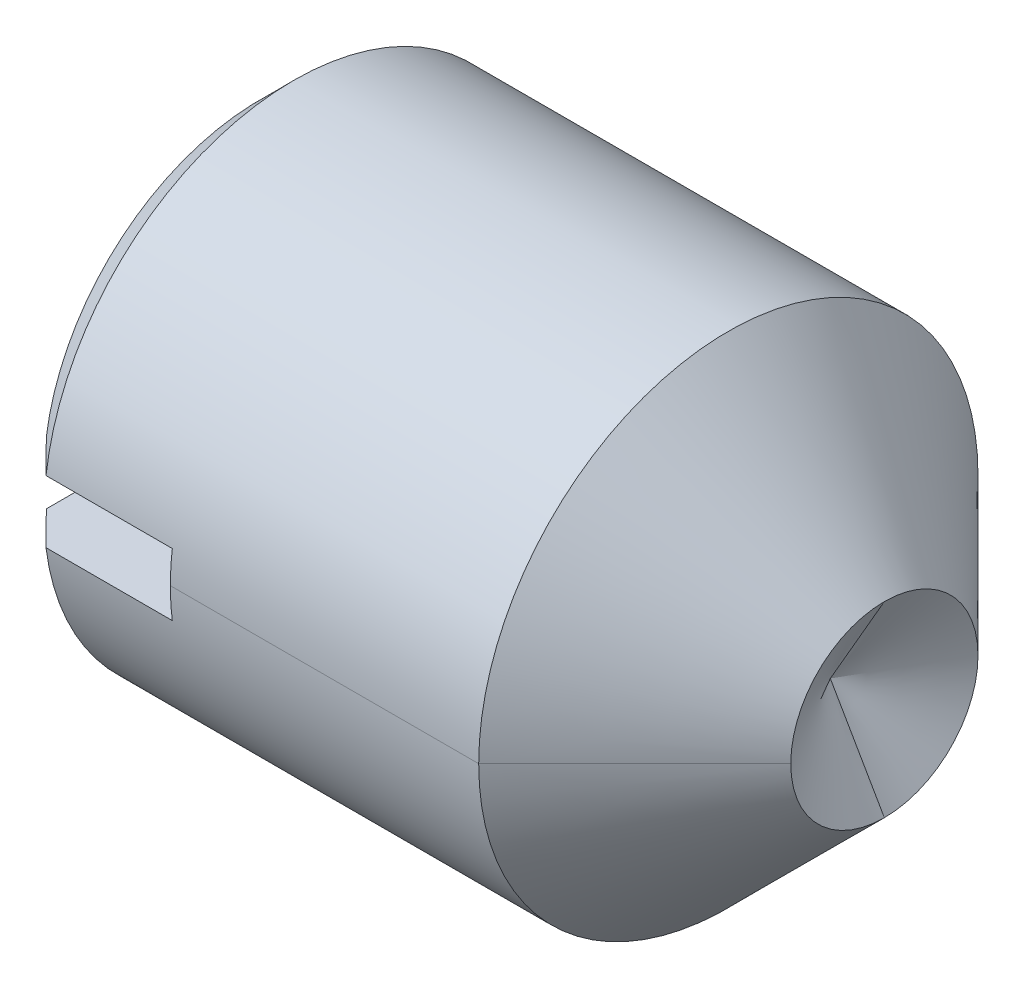
ISO-10303-21;
HEADER;
FILE_DESCRIPTION(('STEP AP214'),'2;1');
FILE_NAME('part.step','',(''),(''),'','','');
FILE_SCHEMA(('AUTOMOTIVE_DESIGN { 1 0 10303 214 1 1 1 1 }'));
ENDSEC;
DATA;
#1=APPLICATION_CONTEXT('core data for automotive mechanical design processes');
#2=APPLICATION_PROTOCOL_DEFINITION('international standard','automotive_design',2000,#1);
#3=PRODUCT_CONTEXT('',#1,'mechanical');
#4=PRODUCT('Part','Part','',(#3));
#5=PRODUCT_RELATED_PRODUCT_CATEGORY('part','',(#4));
#6=PRODUCT_DEFINITION_FORMATION('','',#4);
#7=PRODUCT_DEFINITION_CONTEXT('part definition',#1,'design');
#8=PRODUCT_DEFINITION('design','',#6,#7);
#9=PRODUCT_DEFINITION_SHAPE('','',#8);
#10=(LENGTH_UNIT() NAMED_UNIT(*) SI_UNIT(.MILLI.,.METRE.));
#11=(NAMED_UNIT(*) PLANE_ANGLE_UNIT() SI_UNIT($,.RADIAN.));
#12=(NAMED_UNIT(*) SI_UNIT($,.STERADIAN.) SOLID_ANGLE_UNIT());
#13=UNCERTAINTY_MEASURE_WITH_UNIT(LENGTH_MEASURE(1.E-05),#10,'distance_accuracy_value','');
#14=(GEOMETRIC_REPRESENTATION_CONTEXT(3) GLOBAL_UNCERTAINTY_ASSIGNED_CONTEXT((#13)) GLOBAL_UNIT_ASSIGNED_CONTEXT((#10,
#11,#12)) REPRESENTATION_CONTEXT('',''));
#15=CARTESIAN_POINT('',(0.,0.,0.));
#16=DIRECTION('',(0.,0.,1.));
#17=DIRECTION('',(1.,0.,0.));
#18=AXIS2_PLACEMENT_3D('',#15,#16,#17);
#19=CARTESIAN_POINT('',(1002.28349364905,4.99856837077783E-12,0.));
#20=DIRECTION('',(1.,0.,0.));
#21=DIRECTION('',(0.,1.,0.));
#22=AXIS2_PLACEMENT_3D('',#19,#20,#21);
#23=CONICAL_SURFACE('',#22,1732.05080756862,1.04719755119653);
#24=DIRECTION('',(0.500000000000062,-0.866025403784403,0.));
#25=VECTOR('',#24,1.);
#26=CARTESIAN_POINT('',(2.28349364905388,0.,0.));
#27=LINE('',#26,#25);
#28=CARTESIAN_POINT('',(2.28349364905388,0.,0.));
#29=VERTEX_POINT('',#28);
#30=CARTESIAN_POINT('',(2.5,-0.375,0.));
#31=VERTEX_POINT('',#30);
#32=EDGE_CURVE('E174',#29,#31,#27,.T.);
#33=ORIENTED_EDGE('',*,*,#32,.F.);
#34=DIRECTION('',(0.500000000000053,0.866025403784408,0.));
#35=VECTOR('',#34,1.);
#36=CARTESIAN_POINT('',(2.28349364905388,0.,0.));
#37=LINE('',#36,#35);
#38=CARTESIAN_POINT('',(2.5,0.374999999999946,0.));
#39=VERTEX_POINT('',#38);
#40=EDGE_CURVE('E279',#29,#39,#37,.T.);
#41=ORIENTED_EDGE('',*,*,#40,.T.);
#42=CARTESIAN_POINT('',(2.5,0.,0.));
#43=DIRECTION('',(-1.,0.,0.));
#44=DIRECTION('',(0.,-1.,0.));
#45=AXIS2_PLACEMENT_3D('',#42,#43,#44);
#46=CIRCLE('',#45,0.374999999999973);
#47=CARTESIAN_POINT('',(2.5,0.,0.374999999999973));
#48=VERTEX_POINT('',#47);
#49=EDGE_CURVE('E191',#48,#39,#46,.T.);
#50=ORIENTED_EDGE('',*,*,#49,.F.);
#51=CARTESIAN_POINT('',(2.5,0.,0.));
#52=DIRECTION('',(-1.,0.,0.));
#53=DIRECTION('',(0.,-1.,0.));
#54=AXIS2_PLACEMENT_3D('',#51,#52,#53);
#55=CIRCLE('',#54,0.374999999999973);
#56=EDGE_CURVE('E227',#31,#48,#55,.T.);
#57=ORIENTED_EDGE('',*,*,#56,.F.);
#58=EDGE_LOOP('',(#33,#41,#50,#57));
#59=FACE_BOUND('',#58,.T.);
#60=ADVANCED_FACE('F16',(#59),#23,.F.);
#61=CARTESIAN_POINT('',(0.,-0.125,-50.));
#62=DIRECTION('',(0.,-1.,0.));
#63=DIRECTION('',(0.,0.,-1.));
#64=AXIS2_PLACEMENT_3D('',#61,#62,#63);
#65=PLANE('',#64);
#66=DIRECTION('',(0.,0.,1.));
#67=VECTOR('',#66,1.);
#68=CARTESIAN_POINT('',(0.64,-0.125,-50.));
#69=LINE('',#68,#67);
#70=CARTESIAN_POINT('',(0.64,-0.125,-0.992156741649222));
#71=VERTEX_POINT('',#70);
#72=CARTESIAN_POINT('',(0.64,-0.125,0.992156741649222));
#73=VERTEX_POINT('',#72);
#74=EDGE_CURVE('E10',#71,#73,#69,.T.);
#75=ORIENTED_EDGE('',*,*,#74,.F.);
#76=DIRECTION('',(1.,0.,0.));
#77=VECTOR('',#76,1.);
#78=CARTESIAN_POINT('',(5.24929844129929,-0.125,-0.992156741649221));
#79=LINE('',#78,#77);
#80=CARTESIAN_POINT('',(0.134,-0.125,-0.992156741649221));
#81=VERTEX_POINT('',#80);
#82=EDGE_CURVE('E238',#81,#71,#79,.T.);
#83=ORIENTED_EDGE('',*,*,#82,.F.);
#84=CARTESIAN_POINT('',(0.,-0.125,-0.856931152427078));
#85=CARTESIAN_POINT('',(0.0446346728457518,-0.125,-0.90203819116052));
#86=CARTESIAN_POINT('',(0.0893056631590341,-0.125,-0.947109084394307));
#87=CARTESIAN_POINT('',(0.134,-0.125,-0.992156741649221));
#88=(BOUNDED_CURVE() B_SPLINE_CURVE(3,(#84,#85,#86,#87),.UNSPECIFIED.,.F.,
.F.) B_SPLINE_CURVE_WITH_KNOTS((4,4),(0.00418292871370257,0.00437367850560901),
.UNSPECIFIED.) CURVE() GEOMETRIC_REPRESENTATION_ITEM() RATIONAL_B_SPLINE_CURVE((1.,1.,1.,1.)) REPRESENTATION_ITEM(''));
#89=CARTESIAN_POINT('',(0.,-0.125,-0.856931152427078));
#90=VERTEX_POINT('',#89);
#91=EDGE_CURVE('E50',#90,#81,#88,.T.);
#92=ORIENTED_EDGE('',*,*,#91,.F.);
#93=DIRECTION('',(0.,0.,1.));
#94=VECTOR('',#93,1.);
#95=CARTESIAN_POINT('',(0.,-0.125,-50.));
#96=LINE('',#95,#94);
#97=CARTESIAN_POINT('',(0.,-0.125,0.856931152427078));
#98=VERTEX_POINT('',#97);
#99=EDGE_CURVE('E224',#90,#98,#96,.T.);
#100=ORIENTED_EDGE('',*,*,#99,.T.);
#101=CARTESIAN_POINT('',(0.134000000000004,-0.125,0.992156741649227));
#102=CARTESIAN_POINT('',(0.0893055987008119,-0.125,0.947109019426528));
#103=CARTESIAN_POINT('',(0.0446345984152312,-0.125,0.902038115942306));
#104=CARTESIAN_POINT('',(0.,-0.125,0.856931152427078));
#105=(BOUNDED_CURVE() B_SPLINE_CURVE(3,(#101,#102,#103,#104),.UNSPECIFIED.,.F.,
.F.) B_SPLINE_CURVE_WITH_KNOTS((4,4),(0.00170417551720823,0.00189454872695976),
.UNSPECIFIED.) CURVE() GEOMETRIC_REPRESENTATION_ITEM() RATIONAL_B_SPLINE_CURVE((1.,1.,1.,1.)) REPRESENTATION_ITEM(''));
#106=CARTESIAN_POINT('',(0.134000000000004,-0.125,0.992156741649227));
#107=VERTEX_POINT('',#106);
#108=EDGE_CURVE('E244',#107,#98,#105,.T.);
#109=ORIENTED_EDGE('',*,*,#108,.F.);
#110=DIRECTION('',(-1.,0.,0.));
#111=VECTOR('',#110,1.);
#112=CARTESIAN_POINT('',(5.24929844129929,-0.125,0.992156741649221));
#113=LINE('',#112,#111);
#114=EDGE_CURVE('E181',#73,#107,#113,.T.);
#115=ORIENTED_EDGE('',*,*,#114,.F.);
#116=EDGE_LOOP('',(#75,#83,#92,#100,#109,#115));
#117=FACE_BOUND('',#116,.T.);
#118=ADVANCED_FACE('F302',(#117),#65,.F.);
#119=CARTESIAN_POINT('',(0.,0.125,-50.));
#120=DIRECTION('',(0.,1.,0.));
#121=DIRECTION('',(1.,0.,0.));
#122=AXIS2_PLACEMENT_3D('',#119,#120,#121);
#123=PLANE('',#122);
#124=DIRECTION('',(0.,0.,1.));
#125=VECTOR('',#124,1.);
#126=CARTESIAN_POINT('',(0.64,0.125,-50.));
#127=LINE('',#126,#125);
#128=CARTESIAN_POINT('',(0.64,0.125,-0.992156741649221));
#129=VERTEX_POINT('',#128);
#130=CARTESIAN_POINT('',(0.64,0.125,0.992156741649221));
#131=VERTEX_POINT('',#130);
#132=EDGE_CURVE('E25',#129,#131,#127,.T.);
#133=ORIENTED_EDGE('',*,*,#132,.T.);
#134=DIRECTION('',(1.,0.,0.));
#135=VECTOR('',#134,1.);
#136=CARTESIAN_POINT('',(5.24929844129929,0.125,0.992156741649221));
#137=LINE('',#136,#135);
#138=CARTESIAN_POINT('',(0.134,0.125,0.992156741649221));
#139=VERTEX_POINT('',#138);
#140=EDGE_CURVE('E148',#139,#131,#137,.T.);
#141=ORIENTED_EDGE('',*,*,#140,.F.);
#142=CARTESIAN_POINT('',(0.,0.125,0.856931152427078));
#143=CARTESIAN_POINT('',(0.0446346728457521,0.125,0.90203819116052));
#144=CARTESIAN_POINT('',(0.0893056631590344,0.125,0.947109084394308));
#145=CARTESIAN_POINT('',(0.134,0.125,0.992156741649221));
#146=(BOUNDED_CURVE() B_SPLINE_CURVE(3,(#142,#143,#144,#145),.UNSPECIFIED.,.F.,
.F.) B_SPLINE_CURVE_WITH_KNOTS((4,4),(0.00418292871370257,0.00437367850560901),
.UNSPECIFIED.) CURVE() GEOMETRIC_REPRESENTATION_ITEM() RATIONAL_B_SPLINE_CURVE((1.,1.,1.,1.)) REPRESENTATION_ITEM(''));
#147=CARTESIAN_POINT('',(0.,0.125,0.856931152427078));
#148=VERTEX_POINT('',#147);
#149=EDGE_CURVE('E140',#148,#139,#146,.T.);
#150=ORIENTED_EDGE('',*,*,#149,.F.);
#151=DIRECTION('',(0.,0.,1.));
#152=VECTOR('',#151,1.);
#153=CARTESIAN_POINT('',(0.,0.125,-50.));
#154=LINE('',#153,#152);
#155=CARTESIAN_POINT('',(0.,0.125,-0.856931152427078));
#156=VERTEX_POINT('',#155);
#157=EDGE_CURVE('E135',#156,#148,#154,.T.);
#158=ORIENTED_EDGE('',*,*,#157,.F.);
#159=CARTESIAN_POINT('',(0.134000000000004,0.125,-0.992156741649227));
#160=CARTESIAN_POINT('',(0.0893055987008119,0.125,-0.947109019426528));
#161=CARTESIAN_POINT('',(0.0446345984152312,0.125,-0.902038115942306));
#162=CARTESIAN_POINT('',(0.,0.125,-0.856931152427078));
#163=(BOUNDED_CURVE() B_SPLINE_CURVE(3,(#159,#160,#161,#162),.UNSPECIFIED.,.F.,
.F.) B_SPLINE_CURVE_WITH_KNOTS((4,4),(0.00170417551720823,0.00189454872695976),
.UNSPECIFIED.) CURVE() GEOMETRIC_REPRESENTATION_ITEM() RATIONAL_B_SPLINE_CURVE((1.,1.,1.,1.)) REPRESENTATION_ITEM(''));
#164=CARTESIAN_POINT('',(0.134000000000004,0.125,-0.992156741649227));
#165=VERTEX_POINT('',#164);
#166=EDGE_CURVE('E130',#165,#156,#163,.T.);
#167=ORIENTED_EDGE('',*,*,#166,.F.);
#168=DIRECTION('',(-1.,0.,0.));
#169=VECTOR('',#168,1.);
#170=CARTESIAN_POINT('',(5.24929844129929,0.125,-0.992156741649221));
#171=LINE('',#170,#169);
#172=EDGE_CURVE('E127',#129,#165,#171,.T.);
#173=ORIENTED_EDGE('',*,*,#172,.F.);
#174=EDGE_LOOP('',(#133,#141,#150,#158,#167,#173));
#175=FACE_BOUND('',#174,.T.);
#176=ADVANCED_FACE('F18',(#175),#123,.F.);
#177=CARTESIAN_POINT('',(0.64,-0.125,-50.));
#178=DIRECTION('',(1.,0.,0.));
#179=DIRECTION('',(0.,1.,0.));
#180=AXIS2_PLACEMENT_3D('',#177,#178,#179);
#181=PLANE('',#180);
#182=ORIENTED_EDGE('',*,*,#132,.F.);
#183=CARTESIAN_POINT('',(0.64,0.,0.));
#184=DIRECTION('',(1.,0.,0.));
#185=DIRECTION('',(0.,0.,-1.));
#186=AXIS2_PLACEMENT_3D('',#183,#184,#185);
#187=CIRCLE('',#186,1.);
#188=CARTESIAN_POINT('',(0.64,0.,-1.));
#189=VERTEX_POINT('',#188);
#190=EDGE_CURVE('E155',#189,#129,#187,.T.);
#191=ORIENTED_EDGE('',*,*,#190,.F.);
#192=CARTESIAN_POINT('',(0.64,0.,0.));
#193=DIRECTION('',(1.,0.,0.));
#194=DIRECTION('',(0.,0.,-1.));
#195=AXIS2_PLACEMENT_3D('',#192,#193,#194);
#196=CIRCLE('',#195,1.);
#197=EDGE_CURVE('E245',#71,#189,#196,.T.);
#198=ORIENTED_EDGE('',*,*,#197,.F.);
#199=ORIENTED_EDGE('',*,*,#74,.T.);
#200=CARTESIAN_POINT('',(0.64,0.,0.));
#201=DIRECTION('',(1.,0.,0.));
#202=DIRECTION('',(0.,0.,-1.));
#203=AXIS2_PLACEMENT_3D('',#200,#201,#202);
#204=CIRCLE('',#203,1.);
#205=CARTESIAN_POINT('',(0.64,0.,1.));
#206=VERTEX_POINT('',#205);
#207=EDGE_CURVE('E177',#206,#73,#204,.T.);
#208=ORIENTED_EDGE('',*,*,#207,.F.);
#209=CARTESIAN_POINT('',(0.64,0.,0.));
#210=DIRECTION('',(1.,0.,0.));
#211=DIRECTION('',(0.,0.,-1.));
#212=AXIS2_PLACEMENT_3D('',#209,#210,#211);
#213=CIRCLE('',#212,1.);
#214=EDGE_CURVE('E163',#131,#206,#213,.T.);
#215=ORIENTED_EDGE('',*,*,#214,.F.);
#216=EDGE_LOOP('',(#182,#191,#198,#199,#208,#215));
#217=FACE_BOUND('',#216,.T.);
#218=ADVANCED_FACE('F264',(#217),#181,.F.);
#219=CARTESIAN_POINT('',(0.134,0.,0.));
#220=DIRECTION('',(1.,0.,0.));
#221=DIRECTION('',(0.,0.,-1.));
#222=AXIS2_PLACEMENT_3D('',#219,#220,#221);
#223=CONICAL_SURFACE('',#222,1.,0.785398163397445);
#224=CARTESIAN_POINT('',(0.134,0.,0.));
#225=DIRECTION('',(-1.,0.,0.));
#226=DIRECTION('',(0.,0.,1.));
#227=AXIS2_PLACEMENT_3D('',#224,#225,#226);
#228=CIRCLE('',#227,1.);
#229=EDGE_CURVE('E234',#81,#107,#228,.T.);
#230=ORIENTED_EDGE('',*,*,#229,.T.);
#231=ORIENTED_EDGE('',*,*,#108,.T.);
#232=CARTESIAN_POINT('',(0.,0.,0.));
#233=DIRECTION('',(-1.,0.,0.));
#234=DIRECTION('',(0.,0.,1.));
#235=AXIS2_PLACEMENT_3D('',#232,#233,#234);
#236=CIRCLE('',#235,0.866);
#237=EDGE_CURVE('E216',#90,#98,#236,.T.);
#238=ORIENTED_EDGE('',*,*,#237,.F.);
#239=ORIENTED_EDGE('',*,*,#91,.T.);
#240=EDGE_LOOP('',(#230,#231,#238,#239));
#241=FACE_BOUND('',#240,.T.);
#242=ADVANCED_FACE('F304',(#241),#223,.T.);
#243=CARTESIAN_POINT('',(5.24929844129929,0.,0.));
#244=DIRECTION('',(-1.,0.,0.));
#245=DIRECTION('',(0.,0.,1.));
#246=AXIS2_PLACEMENT_3D('',#243,#244,#245);
#247=CYLINDRICAL_SURFACE('',#246,1.);
#248=DIRECTION('',(-1.,0.,0.));
#249=VECTOR('',#248,1.);
#250=CARTESIAN_POINT('',(5.24929844129929,0.,-1.));
#251=LINE('',#250,#249);
#252=CARTESIAN_POINT('',(1.875,0.,-1.));
#253=VERTEX_POINT('',#252);
#254=EDGE_CURVE('E159',#253,#189,#251,.T.);
#255=ORIENTED_EDGE('',*,*,#254,.F.);
#256=CARTESIAN_POINT('',(1.875,0.,0.));
#257=DIRECTION('',(-1.,0.,0.));
#258=DIRECTION('',(0.,0.,1.));
#259=AXIS2_PLACEMENT_3D('',#256,#257,#258);
#260=CIRCLE('',#259,1.);
#261=CARTESIAN_POINT('',(1.875,0.,1.));
#262=VERTEX_POINT('',#261);
#263=EDGE_CURVE('E183',#253,#262,#260,.T.);
#264=ORIENTED_EDGE('',*,*,#263,.T.);
#265=DIRECTION('',(-1.,0.,0.));
#266=VECTOR('',#265,1.);
#267=CARTESIAN_POINT('',(5.24929844129929,0.,1.));
#268=LINE('',#267,#266);
#269=EDGE_CURVE('E190',#262,#206,#268,.T.);
#270=ORIENTED_EDGE('',*,*,#269,.T.);
#271=ORIENTED_EDGE('',*,*,#207,.T.);
#272=ORIENTED_EDGE('',*,*,#114,.T.);
#273=ORIENTED_EDGE('',*,*,#229,.F.);
#274=ORIENTED_EDGE('',*,*,#82,.T.);
#275=ORIENTED_EDGE('',*,*,#197,.T.);
#276=EDGE_LOOP('',(#255,#264,#270,#271,#272,#273,#274,#275));
#277=FACE_BOUND('',#276,.T.);
#278=ADVANCED_FACE('F305',(#277),#247,.T.);
#279=CARTESIAN_POINT('',(2.5,0.,0.));
#280=DIRECTION('',(-1.,0.,0.));
#281=DIRECTION('',(0.,0.,1.));
#282=AXIS2_PLACEMENT_3D('',#279,#280,#281);
#283=CONICAL_SURFACE('',#282,0.375,0.785398163397442);
#284=DIRECTION('',(-0.707106781186552,0.,-0.707106781186544));
#285=VECTOR('',#284,1.);
#286=CARTESIAN_POINT('',(2.5,0.,-0.375));
#287=LINE('',#286,#285);
#288=CARTESIAN_POINT('',(2.5,0.,-0.374999999999973));
#289=VERTEX_POINT('',#288);
#290=EDGE_CURVE('E192',#289,#253,#287,.T.);
#291=ORIENTED_EDGE('',*,*,#290,.F.);
#292=CARTESIAN_POINT('',(2.5,0.,0.));
#293=DIRECTION('',(-1.,0.,0.));
#294=DIRECTION('',(0.,-1.,0.));
#295=AXIS2_PLACEMENT_3D('',#292,#293,#294);
#296=CIRCLE('',#295,0.374999999999973);
#297=EDGE_CURVE('E169',#289,#31,#296,.T.);
#298=ORIENTED_EDGE('',*,*,#297,.T.);
#299=ORIENTED_EDGE('',*,*,#56,.T.);
#300=DIRECTION('',(-0.707106781186552,0.,0.707106781186544));
#301=VECTOR('',#300,1.);
#302=CARTESIAN_POINT('',(2.5,0.,0.375));
#303=LINE('',#302,#301);
#304=EDGE_CURVE('E194',#48,#262,#303,.T.);
#305=ORIENTED_EDGE('',*,*,#304,.T.);
#306=ORIENTED_EDGE('',*,*,#263,.F.);
#307=EDGE_LOOP('',(#291,#298,#299,#305,#306));
#308=FACE_BOUND('',#307,.T.);
#309=ADVANCED_FACE('F299',(#308),#283,.T.);
#310=CARTESIAN_POINT('',(0.,0.866,0.));
#311=DIRECTION('',(1.,0.,0.));
#312=DIRECTION('',(0.,1.,0.));
#313=AXIS2_PLACEMENT_3D('',#310,#311,#312);
#314=PLANE('',#313);
#315=ORIENTED_EDGE('',*,*,#237,.T.);
#316=ORIENTED_EDGE('',*,*,#99,.F.);
#317=EDGE_LOOP('',(#315,#316));
#318=FACE_BOUND('',#317,.T.);
#319=ADVANCED_FACE('F306',(#318),#314,.F.);
#320=CARTESIAN_POINT('',(0.134,0.,0.));
#321=DIRECTION('',(1.,0.,0.));
#322=DIRECTION('',(0.,0.,-1.));
#323=AXIS2_PLACEMENT_3D('',#320,#321,#322);
#324=CONICAL_SURFACE('',#323,1.,0.785398163397445);
#325=CARTESIAN_POINT('',(0.134,0.,0.));
#326=DIRECTION('',(-1.,0.,0.));
#327=DIRECTION('',(0.,0.,1.));
#328=AXIS2_PLACEMENT_3D('',#325,#326,#327);
#329=CIRCLE('',#328,1.);
#330=EDGE_CURVE('E139',#139,#165,#329,.T.);
#331=ORIENTED_EDGE('',*,*,#330,.T.);
#332=ORIENTED_EDGE('',*,*,#166,.T.);
#333=CARTESIAN_POINT('',(0.,0.,0.));
#334=DIRECTION('',(-1.,0.,0.));
#335=DIRECTION('',(0.,0.,1.));
#336=AXIS2_PLACEMENT_3D('',#333,#334,#335);
#337=CIRCLE('',#336,0.866);
#338=EDGE_CURVE('E200',#148,#156,#337,.T.);
#339=ORIENTED_EDGE('',*,*,#338,.F.);
#340=ORIENTED_EDGE('',*,*,#149,.T.);
#341=EDGE_LOOP('',(#331,#332,#339,#340));
#342=FACE_BOUND('',#341,.T.);
#343=ADVANCED_FACE('F143',(#342),#324,.T.);
#344=CARTESIAN_POINT('',(0.,0.866,0.));
#345=DIRECTION('',(1.,0.,0.));
#346=DIRECTION('',(0.,1.,0.));
#347=AXIS2_PLACEMENT_3D('',#344,#345,#346);
#348=PLANE('',#347);
#349=ORIENTED_EDGE('',*,*,#338,.T.);
#350=ORIENTED_EDGE('',*,*,#157,.T.);
#351=EDGE_LOOP('',(#349,#350));
#352=FACE_BOUND('',#351,.T.);
#353=ADVANCED_FACE('F316',(#352),#348,.F.);
#354=CARTESIAN_POINT('',(2.5,0.,0.));
#355=DIRECTION('',(-1.,0.,0.));
#356=DIRECTION('',(0.,0.,1.));
#357=AXIS2_PLACEMENT_3D('',#354,#355,#356);
#358=CONICAL_SURFACE('',#357,0.375,0.785398163397442);
#359=ORIENTED_EDGE('',*,*,#49,.T.);
#360=CARTESIAN_POINT('',(2.5,0.,0.));
#361=DIRECTION('',(-1.,0.,0.));
#362=DIRECTION('',(0.,-1.,0.));
#363=AXIS2_PLACEMENT_3D('',#360,#361,#362);
#364=CIRCLE('',#363,0.374999999999973);
#365=EDGE_CURVE('E172',#39,#289,#364,.T.);
#366=ORIENTED_EDGE('',*,*,#365,.T.);
#367=ORIENTED_EDGE('',*,*,#290,.T.);
#368=CARTESIAN_POINT('',(1.875,0.,0.));
#369=DIRECTION('',(-1.,0.,0.));
#370=DIRECTION('',(0.,0.,1.));
#371=AXIS2_PLACEMENT_3D('',#368,#369,#370);
#372=CIRCLE('',#371,1.);
#373=EDGE_CURVE('E170',#262,#253,#372,.T.);
#374=ORIENTED_EDGE('',*,*,#373,.F.);
#375=ORIENTED_EDGE('',*,*,#304,.F.);
#376=EDGE_LOOP('',(#359,#366,#367,#374,#375));
#377=FACE_BOUND('',#376,.T.);
#378=ADVANCED_FACE('F294',(#377),#358,.T.);
#379=CARTESIAN_POINT('',(5.24929844129929,0.,0.));
#380=DIRECTION('',(-1.,0.,0.));
#381=DIRECTION('',(0.,0.,1.));
#382=AXIS2_PLACEMENT_3D('',#379,#380,#381);
#383=CYLINDRICAL_SURFACE('',#382,1.);
#384=ORIENTED_EDGE('',*,*,#373,.T.);
#385=ORIENTED_EDGE('',*,*,#254,.T.);
#386=ORIENTED_EDGE('',*,*,#190,.T.);
#387=ORIENTED_EDGE('',*,*,#172,.T.);
#388=ORIENTED_EDGE('',*,*,#330,.F.);
#389=ORIENTED_EDGE('',*,*,#140,.T.);
#390=ORIENTED_EDGE('',*,*,#214,.T.);
#391=ORIENTED_EDGE('',*,*,#269,.F.);
#392=EDGE_LOOP('',(#384,#385,#386,#387,#388,#389,#390,#391));
#393=FACE_BOUND('',#392,.T.);
#394=ADVANCED_FACE('F149',(#393),#383,.T.);
#395=CARTESIAN_POINT('',(1002.28349364905,4.99856837077783E-12,0.));
#396=DIRECTION('',(1.,0.,0.));
#397=DIRECTION('',(0.,1.,0.));
#398=AXIS2_PLACEMENT_3D('',#395,#396,#397);
#399=CONICAL_SURFACE('',#398,1732.05080756862,1.04719755119653);
#400=ORIENTED_EDGE('',*,*,#40,.F.);
#401=ORIENTED_EDGE('',*,*,#32,.T.);
#402=ORIENTED_EDGE('',*,*,#297,.F.);
#403=ORIENTED_EDGE('',*,*,#365,.F.);
#404=EDGE_LOOP('',(#400,#401,#402,#403));
#405=FACE_BOUND('',#404,.T.);
#406=ADVANCED_FACE('F291',(#405),#399,.F.);
#407=CLOSED_SHELL('',(#60,#118,#176,#218,#242,#278,#309,#319,#343,#353,#378,#394,#406));
#408=MANIFOLD_SOLID_BREP('B1',#407);
#409=ADVANCED_BREP_SHAPE_REPRESENTATION('',(#18,#408),#14);
#410=SHAPE_DEFINITION_REPRESENTATION(#9,#409);
ENDSEC;
END-ISO-10303-21;
